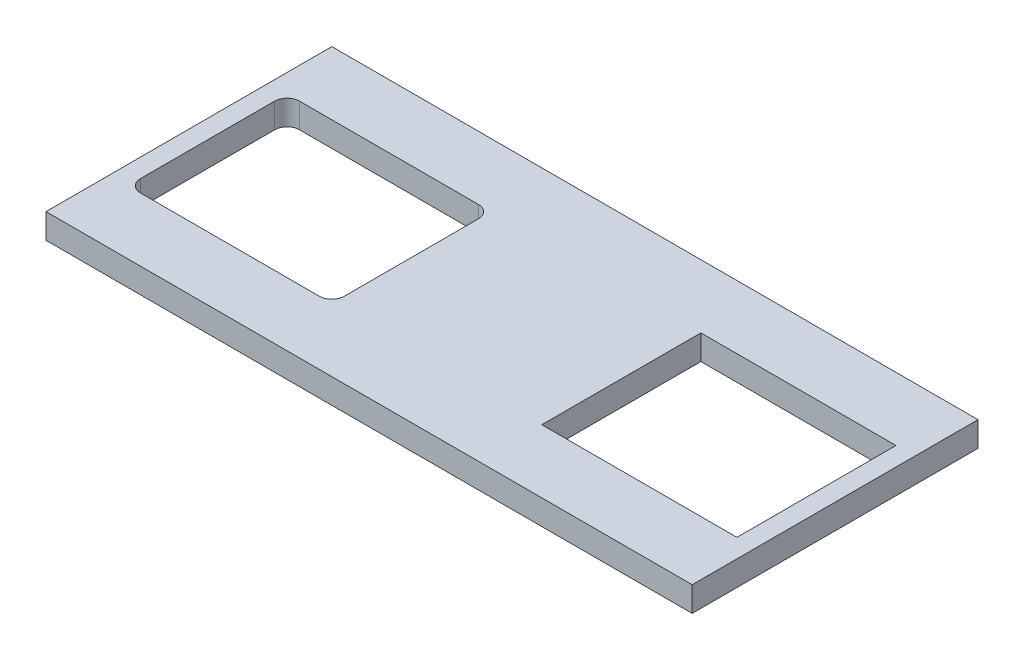
ISO-10303-21;
HEADER;
FILE_DESCRIPTION(('STEP AP214'),'2;1');
FILE_NAME('part.step','',(''),(''),'','','');
FILE_SCHEMA(('AUTOMOTIVE_DESIGN { 1 0 10303 214 1 1 1 1 }'));
ENDSEC;
DATA;
#1=APPLICATION_CONTEXT('core data for automotive mechanical design processes');
#2=APPLICATION_PROTOCOL_DEFINITION('international standard','automotive_design',2000,#1);
#3=PRODUCT_CONTEXT('',#1,'mechanical');
#4=PRODUCT('Part','Part','',(#3));
#5=PRODUCT_RELATED_PRODUCT_CATEGORY('part','',(#4));
#6=PRODUCT_DEFINITION_FORMATION('','',#4);
#7=PRODUCT_DEFINITION_CONTEXT('part definition',#1,'design');
#8=PRODUCT_DEFINITION('design','',#6,#7);
#9=PRODUCT_DEFINITION_SHAPE('','',#8);
#10=(LENGTH_UNIT() NAMED_UNIT(*) SI_UNIT(.MILLI.,.METRE.));
#11=(NAMED_UNIT(*) PLANE_ANGLE_UNIT() SI_UNIT($,.RADIAN.));
#12=(NAMED_UNIT(*) SI_UNIT($,.STERADIAN.) SOLID_ANGLE_UNIT());
#13=UNCERTAINTY_MEASURE_WITH_UNIT(LENGTH_MEASURE(1.E-05),#10,'distance_accuracy_value','');
#14=(GEOMETRIC_REPRESENTATION_CONTEXT(3) GLOBAL_UNCERTAINTY_ASSIGNED_CONTEXT((#13)) GLOBAL_UNIT_ASSIGNED_CONTEXT((#10,
#11,#12)) REPRESENTATION_CONTEXT('',''));
#15=CARTESIAN_POINT('',(0.,0.,0.));
#16=DIRECTION('',(0.,0.,1.));
#17=DIRECTION('',(1.,0.,0.));
#18=AXIS2_PLACEMENT_3D('',#15,#16,#17);
#19=CARTESIAN_POINT('',(0.,10.,-89.5000000000001));
#20=DIRECTION('',(0.,0.,-1.));
#21=DIRECTION('',(-1.,0.,0.));
#22=AXIS2_PLACEMENT_3D('',#19,#20,#21);
#23=PLANE('',#22);
#24=DIRECTION('',(1.,0.,0.));
#25=VECTOR('',#24,1.);
#26=CARTESIAN_POINT('',(0.,0.,-89.5000000000001));
#27=LINE('',#26,#25);
#28=CARTESIAN_POINT('',(-85.9931150513852,0.,-89.5000000000001));
#29=VERTEX_POINT('',#28);
#30=CARTESIAN_POINT('',(-7.50000000000001,0.,-89.5000000000001));
#31=VERTEX_POINT('',#30);
#32=EDGE_CURVE('E239',#29,#31,#27,.T.);
#33=ORIENTED_EDGE('',*,*,#32,.T.);
#34=DIRECTION('',(0.,-1.,0.));
#35=VECTOR('',#34,1.);
#36=CARTESIAN_POINT('',(-7.50000000000001,10.,-89.5000000000001));
#37=LINE('',#36,#35);
#38=CARTESIAN_POINT('',(-7.50000000000001,10.,-89.5000000000001));
#39=VERTEX_POINT('',#38);
#40=EDGE_CURVE('E11',#39,#31,#37,.T.);
#41=ORIENTED_EDGE('',*,*,#40,.F.);
#42=DIRECTION('',(1.,0.,0.));
#43=VECTOR('',#42,1.);
#44=CARTESIAN_POINT('',(0.,10.,-89.5000000000001));
#45=LINE('',#44,#43);
#46=CARTESIAN_POINT('',(-85.9931150513852,10.,-89.5000000000001));
#47=VERTEX_POINT('',#46);
#48=EDGE_CURVE('E171',#47,#39,#45,.T.);
#49=ORIENTED_EDGE('',*,*,#48,.F.);
#50=DIRECTION('',(0.,-1.,0.));
#51=VECTOR('',#50,1.);
#52=CARTESIAN_POINT('',(-85.9931150513852,10.,-89.5000000000001));
#53=LINE('',#52,#51);
#54=EDGE_CURVE('E63',#47,#29,#53,.T.);
#55=ORIENTED_EDGE('',*,*,#54,.T.);
#56=EDGE_LOOP('',(#33,#41,#49,#55));
#57=FACE_BOUND('',#56,.T.);
#58=ADVANCED_FACE('F43',(#57),#23,.F.);
#59=CARTESIAN_POINT('',(-7.5,10.,0.));
#60=DIRECTION('',(1.,0.,0.));
#61=DIRECTION('',(0.,0.,-1.));
#62=AXIS2_PLACEMENT_3D('',#59,#60,#61);
#63=PLANE('',#62);
#64=DIRECTION('',(0.,0.,1.));
#65=VECTOR('',#64,1.);
#66=CARTESIAN_POINT('',(-7.5,0.,0.));
#67=LINE('',#66,#65);
#68=CARTESIAN_POINT('',(-7.5,0.,-25.5000000000001));
#69=VERTEX_POINT('',#68);
#70=EDGE_CURVE('E178',#31,#69,#67,.T.);
#71=ORIENTED_EDGE('',*,*,#70,.T.);
#72=DIRECTION('',(0.,-1.,0.));
#73=VECTOR('',#72,1.);
#74=CARTESIAN_POINT('',(-7.5,10.,-25.5000000000001));
#75=LINE('',#74,#73);
#76=CARTESIAN_POINT('',(-7.5,10.,-25.5000000000001));
#77=VERTEX_POINT('',#76);
#78=EDGE_CURVE('E54',#77,#69,#75,.T.);
#79=ORIENTED_EDGE('',*,*,#78,.F.);
#80=DIRECTION('',(0.,0.,1.));
#81=VECTOR('',#80,1.);
#82=CARTESIAN_POINT('',(-7.5,10.,0.));
#83=LINE('',#82,#81);
#84=EDGE_CURVE('E165',#39,#77,#83,.T.);
#85=ORIENTED_EDGE('',*,*,#84,.F.);
#86=ORIENTED_EDGE('',*,*,#40,.T.);
#87=EDGE_LOOP('',(#71,#79,#85,#86));
#88=FACE_BOUND('',#87,.T.);
#89=ADVANCED_FACE('F177',(#88),#63,.F.);
#90=CARTESIAN_POINT('',(0.,10.,-25.5000000000001));
#91=DIRECTION('',(0.,0.,-1.));
#92=DIRECTION('',(-1.,0.,0.));
#93=AXIS2_PLACEMENT_3D('',#90,#91,#92);
#94=PLANE('',#93);
#95=DIRECTION('',(1.,0.,0.));
#96=VECTOR('',#95,1.);
#97=CARTESIAN_POINT('',(0.,0.,-25.5000000000001));
#98=LINE('',#97,#96);
#99=CARTESIAN_POINT('',(-85.9931150513852,0.,-25.5000000000001));
#100=VERTEX_POINT('',#99);
#101=EDGE_CURVE('E244',#100,#69,#98,.T.);
#102=ORIENTED_EDGE('',*,*,#101,.F.);
#103=DIRECTION('',(0.,-1.,0.));
#104=VECTOR('',#103,1.);
#105=CARTESIAN_POINT('',(-85.9931150513852,10.,-25.5000000000001));
#106=LINE('',#105,#104);
#107=CARTESIAN_POINT('',(-85.9931150513852,10.,-25.5000000000001));
#108=VERTEX_POINT('',#107);
#109=EDGE_CURVE('E113',#108,#100,#106,.T.);
#110=ORIENTED_EDGE('',*,*,#109,.F.);
#111=DIRECTION('',(1.,0.,0.));
#112=VECTOR('',#111,1.);
#113=CARTESIAN_POINT('',(0.,10.,-25.5000000000001));
#114=LINE('',#113,#112);
#115=EDGE_CURVE('E170',#108,#77,#114,.T.);
#116=ORIENTED_EDGE('',*,*,#115,.T.);
#117=ORIENTED_EDGE('',*,*,#78,.T.);
#118=EDGE_LOOP('',(#102,#110,#116,#117));
#119=FACE_BOUND('',#118,.T.);
#120=ADVANCED_FACE('F183',(#119),#94,.T.);
#121=CARTESIAN_POINT('',(-260.,10.,0.));
#122=DIRECTION('',(-1.,0.,0.));
#123=DIRECTION('',(0.,0.,1.));
#124=AXIS2_PLACEMENT_3D('',#121,#122,#123);
#125=PLANE('',#124);
#126=DIRECTION('',(0.,0.,-1.));
#127=VECTOR('',#126,1.);
#128=CARTESIAN_POINT('',(-260.,0.,0.));
#129=LINE('',#128,#127);
#130=CARTESIAN_POINT('',(-260.,0.,0.));
#131=VERTEX_POINT('',#130);
#132=CARTESIAN_POINT('',(-260.,0.,-115.));
#133=VERTEX_POINT('',#132);
#134=EDGE_CURVE('E223',#131,#133,#129,.T.);
#135=ORIENTED_EDGE('',*,*,#134,.F.);
#136=DIRECTION('',(0.,-1.,0.));
#137=VECTOR('',#136,1.);
#138=CARTESIAN_POINT('',(-260.,10.,0.));
#139=LINE('',#138,#137);
#140=CARTESIAN_POINT('',(-260.,10.,0.));
#141=VERTEX_POINT('',#140);
#142=EDGE_CURVE('E254',#141,#131,#139,.T.);
#143=ORIENTED_EDGE('',*,*,#142,.F.);
#144=DIRECTION('',(0.,0.,-1.));
#145=VECTOR('',#144,1.);
#146=CARTESIAN_POINT('',(-260.,10.,0.));
#147=LINE('',#146,#145);
#148=CARTESIAN_POINT('',(-260.,10.,-115.));
#149=VERTEX_POINT('',#148);
#150=EDGE_CURVE('E352',#141,#149,#147,.T.);
#151=ORIENTED_EDGE('',*,*,#150,.T.);
#152=DIRECTION('',(0.,-1.,0.));
#153=VECTOR('',#152,1.);
#154=CARTESIAN_POINT('',(-260.,10.,-115.));
#155=LINE('',#154,#153);
#156=EDGE_CURVE('E257',#149,#133,#155,.T.);
#157=ORIENTED_EDGE('',*,*,#156,.T.);
#158=EDGE_LOOP('',(#135,#143,#151,#157));
#159=FACE_BOUND('',#158,.T.);
#160=ADVANCED_FACE('F376',(#159),#125,.T.);
#161=CARTESIAN_POINT('',(0.,10.,0.));
#162=DIRECTION('',(0.,0.,1.));
#163=DIRECTION('',(1.,0.,0.));
#164=AXIS2_PLACEMENT_3D('',#161,#162,#163);
#165=PLANE('',#164);
#166=DIRECTION('',(-1.,0.,0.));
#167=VECTOR('',#166,1.);
#168=CARTESIAN_POINT('',(0.,0.,0.));
#169=LINE('',#168,#167);
#170=CARTESIAN_POINT('',(0.,0.,0.));
#171=VERTEX_POINT('',#170);
#172=EDGE_CURVE('E227',#171,#131,#169,.T.);
#173=ORIENTED_EDGE('',*,*,#172,.F.);
#174=DIRECTION('',(0.,-1.,0.));
#175=VECTOR('',#174,1.);
#176=CARTESIAN_POINT('',(0.,10.,0.));
#177=LINE('',#176,#175);
#178=CARTESIAN_POINT('',(0.,10.,0.));
#179=VERTEX_POINT('',#178);
#180=EDGE_CURVE('E264',#179,#171,#177,.T.);
#181=ORIENTED_EDGE('',*,*,#180,.F.);
#182=DIRECTION('',(-1.,0.,0.));
#183=VECTOR('',#182,1.);
#184=CARTESIAN_POINT('',(0.,10.,0.));
#185=LINE('',#184,#183);
#186=EDGE_CURVE('E356',#179,#141,#185,.T.);
#187=ORIENTED_EDGE('',*,*,#186,.T.);
#188=ORIENTED_EDGE('',*,*,#142,.T.);
#189=EDGE_LOOP('',(#173,#181,#187,#188));
#190=FACE_BOUND('',#189,.T.);
#191=ADVANCED_FACE('F379',(#190),#165,.T.);
#192=CARTESIAN_POINT('',(0.,10.,0.));
#193=DIRECTION('',(-1.,0.,0.));
#194=DIRECTION('',(0.,0.,1.));
#195=AXIS2_PLACEMENT_3D('',#192,#193,#194);
#196=PLANE('',#195);
#197=DIRECTION('',(0.,0.,-1.));
#198=VECTOR('',#197,1.);
#199=CARTESIAN_POINT('',(0.,0.,0.));
#200=LINE('',#199,#198);
#201=CARTESIAN_POINT('',(0.,0.,-115.));
#202=VERTEX_POINT('',#201);
#203=EDGE_CURVE('E231',#171,#202,#200,.T.);
#204=ORIENTED_EDGE('',*,*,#203,.T.);
#205=DIRECTION('',(0.,-1.,0.));
#206=VECTOR('',#205,1.);
#207=CARTESIAN_POINT('',(0.,10.,-115.));
#208=LINE('',#207,#206);
#209=CARTESIAN_POINT('',(0.,10.,-115.));
#210=VERTEX_POINT('',#209);
#211=EDGE_CURVE('E260',#210,#202,#208,.T.);
#212=ORIENTED_EDGE('',*,*,#211,.F.);
#213=DIRECTION('',(0.,0.,-1.));
#214=VECTOR('',#213,1.);
#215=CARTESIAN_POINT('',(0.,10.,0.));
#216=LINE('',#215,#214);
#217=EDGE_CURVE('E360',#179,#210,#216,.T.);
#218=ORIENTED_EDGE('',*,*,#217,.F.);
#219=ORIENTED_EDGE('',*,*,#180,.T.);
#220=EDGE_LOOP('',(#204,#212,#218,#219));
#221=FACE_BOUND('',#220,.T.);
#222=ADVANCED_FACE('F382',(#221),#196,.F.);
#223=CARTESIAN_POINT('',(-247.5,10.,-84.4999999999999));
#224=DIRECTION('',(0.,-1.,0.));
#225=DIRECTION('',(0.,0.,-1.));
#226=AXIS2_PLACEMENT_3D('',#223,#224,#225);
#227=CYLINDRICAL_SURFACE('',#226,5.);
#228=CARTESIAN_POINT('',(-247.5,0.,-84.4999999999999));
#229=DIRECTION('',(0.,1.,0.));
#230=DIRECTION('',(0.,0.,1.));
#231=AXIS2_PLACEMENT_3D('',#228,#229,#230);
#232=CIRCLE('',#231,5.);
#233=CARTESIAN_POINT('',(-247.5,0.,-89.4999999999999));
#234=VERTEX_POINT('',#233);
#235=CARTESIAN_POINT('',(-252.5,0.,-84.4999999999999));
#236=VERTEX_POINT('',#235);
#237=EDGE_CURVE('E192',#234,#236,#232,.T.);
#238=ORIENTED_EDGE('',*,*,#237,.F.);
#239=DIRECTION('',(0.,-1.,0.));
#240=VECTOR('',#239,1.);
#241=CARTESIAN_POINT('',(-247.5,10.,-89.4999999999999));
#242=LINE('',#241,#240);
#243=CARTESIAN_POINT('',(-247.5,10.,-89.4999999999999));
#244=VERTEX_POINT('',#243);
#245=EDGE_CURVE('E47',#244,#234,#242,.T.);
#246=ORIENTED_EDGE('',*,*,#245,.F.);
#247=CARTESIAN_POINT('',(-247.5,10.,-84.4999999999999));
#248=DIRECTION('',(0.,1.,0.));
#249=DIRECTION('',(0.,0.,1.));
#250=AXIS2_PLACEMENT_3D('',#247,#248,#249);
#251=CIRCLE('',#250,5.);
#252=CARTESIAN_POINT('',(-252.5,10.,-84.4999999999999));
#253=VERTEX_POINT('',#252);
#254=EDGE_CURVE('E251',#244,#253,#251,.T.);
#255=ORIENTED_EDGE('',*,*,#254,.T.);
#256=DIRECTION('',(0.,-1.,0.));
#257=VECTOR('',#256,1.);
#258=CARTESIAN_POINT('',(-252.5,10.,-84.4999999999999));
#259=LINE('',#258,#257);
#260=EDGE_CURVE('E188',#253,#236,#259,.T.);
#261=ORIENTED_EDGE('',*,*,#260,.T.);
#262=EDGE_LOOP('',(#238,#246,#255,#261));
#263=FACE_BOUND('',#262,.T.);
#264=ADVANCED_FACE('F45',(#263),#227,.F.);
#265=CARTESIAN_POINT('',(0.,10.,-89.5000000000001));
#266=DIRECTION('',(0.,0.,-1.));
#267=DIRECTION('',(-1.,0.,0.));
#268=AXIS2_PLACEMENT_3D('',#265,#266,#267);
#269=PLANE('',#268);
#270=DIRECTION('',(1.,0.,0.));
#271=VECTOR('',#270,1.);
#272=CARTESIAN_POINT('',(0.,0.,-89.5000000000001));
#273=LINE('',#272,#271);
#274=CARTESIAN_POINT('',(-175.5,0.,-89.5));
#275=VERTEX_POINT('',#274);
#276=EDGE_CURVE('E196',#234,#275,#273,.T.);
#277=ORIENTED_EDGE('',*,*,#276,.T.);
#278=DIRECTION('',(0.,-1.,0.));
#279=VECTOR('',#278,1.);
#280=CARTESIAN_POINT('',(-175.5,10.,-89.5));
#281=LINE('',#280,#279);
#282=CARTESIAN_POINT('',(-175.5,10.,-89.5));
#283=VERTEX_POINT('',#282);
#284=EDGE_CURVE('E286',#283,#275,#281,.T.);
#285=ORIENTED_EDGE('',*,*,#284,.F.);
#286=DIRECTION('',(1.,0.,0.));
#287=VECTOR('',#286,1.);
#288=CARTESIAN_POINT('',(0.,10.,-89.5000000000001));
#289=LINE('',#288,#287);
#290=EDGE_CURVE('E296',#244,#283,#289,.T.);
#291=ORIENTED_EDGE('',*,*,#290,.F.);
#292=ORIENTED_EDGE('',*,*,#245,.T.);
#293=EDGE_LOOP('',(#277,#285,#291,#292));
#294=FACE_BOUND('',#293,.T.);
#295=ADVANCED_FACE('F295',(#294),#269,.F.);
#296=CARTESIAN_POINT('',(-175.5,10.,-84.5));
#297=DIRECTION('',(0.,-1.,0.));
#298=DIRECTION('',(0.,0.,-1.));
#299=AXIS2_PLACEMENT_3D('',#296,#297,#298);
#300=CYLINDRICAL_SURFACE('',#299,5.);
#301=CARTESIAN_POINT('',(-175.5,0.,-84.5));
#302=DIRECTION('',(0.,1.,0.));
#303=DIRECTION('',(0.,0.,1.));
#304=AXIS2_PLACEMENT_3D('',#301,#302,#303);
#305=CIRCLE('',#304,5.);
#306=CARTESIAN_POINT('',(-170.5,0.,-84.4999999999999));
#307=VERTEX_POINT('',#306);
#308=EDGE_CURVE('E200',#307,#275,#305,.T.);
#309=ORIENTED_EDGE('',*,*,#308,.F.);
#310=DIRECTION('',(0.,-1.,0.));
#311=VECTOR('',#310,1.);
#312=CARTESIAN_POINT('',(-170.5,10.,-84.4999999999999));
#313=LINE('',#312,#311);
#314=CARTESIAN_POINT('',(-170.5,10.,-84.4999999999999));
#315=VERTEX_POINT('',#314);
#316=EDGE_CURVE('E284',#315,#307,#313,.T.);
#317=ORIENTED_EDGE('',*,*,#316,.F.);
#318=CARTESIAN_POINT('',(-175.5,10.,-84.5));
#319=DIRECTION('',(0.,1.,0.));
#320=DIRECTION('',(0.,0.,1.));
#321=AXIS2_PLACEMENT_3D('',#318,#319,#320);
#322=CIRCLE('',#321,5.);
#323=EDGE_CURVE('E330',#315,#283,#322,.T.);
#324=ORIENTED_EDGE('',*,*,#323,.T.);
#325=ORIENTED_EDGE('',*,*,#284,.T.);
#326=EDGE_LOOP('',(#309,#317,#324,#325));
#327=FACE_BOUND('',#326,.T.);
#328=ADVANCED_FACE('F327',(#327),#300,.F.);
#329=CARTESIAN_POINT('',(-170.5,10.,0.));
#330=DIRECTION('',(1.,0.,0.));
#331=DIRECTION('',(0.,0.,-1.));
#332=AXIS2_PLACEMENT_3D('',#329,#330,#331);
#333=PLANE('',#332);
#334=DIRECTION('',(0.,0.,1.));
#335=VECTOR('',#334,1.);
#336=CARTESIAN_POINT('',(-170.5,0.,0.));
#337=LINE('',#336,#335);
#338=CARTESIAN_POINT('',(-170.5,0.,-30.5));
#339=VERTEX_POINT('',#338);
#340=EDGE_CURVE('E204',#307,#339,#337,.T.);
#341=ORIENTED_EDGE('',*,*,#340,.T.);
#342=DIRECTION('',(0.,-1.,0.));
#343=VECTOR('',#342,1.);
#344=CARTESIAN_POINT('',(-170.5,10.,-30.5));
#345=LINE('',#344,#343);
#346=CARTESIAN_POINT('',(-170.5,10.,-30.5));
#347=VERTEX_POINT('',#346);
#348=EDGE_CURVE('E280',#347,#339,#345,.T.);
#349=ORIENTED_EDGE('',*,*,#348,.F.);
#350=DIRECTION('',(0.,0.,1.));
#351=VECTOR('',#350,1.);
#352=CARTESIAN_POINT('',(-170.5,10.,0.));
#353=LINE('',#352,#351);
#354=EDGE_CURVE('E331',#315,#347,#353,.T.);
#355=ORIENTED_EDGE('',*,*,#354,.F.);
#356=ORIENTED_EDGE('',*,*,#316,.T.);
#357=EDGE_LOOP('',(#341,#349,#355,#356));
#358=FACE_BOUND('',#357,.T.);
#359=ADVANCED_FACE('F332',(#358),#333,.F.);
#360=CARTESIAN_POINT('',(-175.5,10.,-30.5));
#361=DIRECTION('',(0.,-1.,0.));
#362=DIRECTION('',(0.,0.,-1.));
#363=AXIS2_PLACEMENT_3D('',#360,#361,#362);
#364=CYLINDRICAL_SURFACE('',#363,5.);
#365=CARTESIAN_POINT('',(-175.5,0.,-30.5));
#366=DIRECTION('',(0.,1.,0.));
#367=DIRECTION('',(0.,0.,1.));
#368=AXIS2_PLACEMENT_3D('',#365,#366,#367);
#369=CIRCLE('',#368,5.);
#370=CARTESIAN_POINT('',(-175.5,0.,-25.5));
#371=VERTEX_POINT('',#370);
#372=EDGE_CURVE('E207',#339,#371,#369,.F.);
#373=ORIENTED_EDGE('',*,*,#372,.T.);
#374=DIRECTION('',(0.,-1.,0.));
#375=VECTOR('',#374,1.);
#376=CARTESIAN_POINT('',(-175.5,10.,-25.5));
#377=LINE('',#376,#375);
#378=CARTESIAN_POINT('',(-175.5,10.,-25.5));
#379=VERTEX_POINT('',#378);
#380=EDGE_CURVE('E277',#379,#371,#377,.T.);
#381=ORIENTED_EDGE('',*,*,#380,.F.);
#382=CARTESIAN_POINT('',(-175.5,10.,-30.5));
#383=DIRECTION('',(0.,1.,0.));
#384=DIRECTION('',(0.,0.,1.));
#385=AXIS2_PLACEMENT_3D('',#382,#383,#384);
#386=CIRCLE('',#385,5.);
#387=EDGE_CURVE('E335',#347,#379,#386,.F.);
#388=ORIENTED_EDGE('',*,*,#387,.F.);
#389=ORIENTED_EDGE('',*,*,#348,.T.);
#390=EDGE_LOOP('',(#373,#381,#388,#389));
#391=FACE_BOUND('',#390,.T.);
#392=ADVANCED_FACE('F324',(#391),#364,.F.);
#393=CARTESIAN_POINT('',(0.,10.,-25.4999999999999));
#394=DIRECTION('',(0.,0.,-1.));
#395=DIRECTION('',(-1.,0.,0.));
#396=AXIS2_PLACEMENT_3D('',#393,#394,#395);
#397=PLANE('',#396);
#398=DIRECTION('',(1.,0.,0.));
#399=VECTOR('',#398,1.);
#400=CARTESIAN_POINT('',(0.,0.,-25.4999999999999));
#401=LINE('',#400,#399);
#402=CARTESIAN_POINT('',(-247.5,0.,-25.5));
#403=VERTEX_POINT('',#402);
#404=EDGE_CURVE('E211',#403,#371,#401,.T.);
#405=ORIENTED_EDGE('',*,*,#404,.F.);
#406=DIRECTION('',(0.,-1.,0.));
#407=VECTOR('',#406,1.);
#408=CARTESIAN_POINT('',(-247.5,10.,-25.5));
#409=LINE('',#408,#407);
#410=CARTESIAN_POINT('',(-247.5,10.,-25.5));
#411=VERTEX_POINT('',#410);
#412=EDGE_CURVE('E274',#411,#403,#409,.T.);
#413=ORIENTED_EDGE('',*,*,#412,.F.);
#414=DIRECTION('',(1.,0.,0.));
#415=VECTOR('',#414,1.);
#416=CARTESIAN_POINT('',(0.,10.,-25.4999999999999));
#417=LINE('',#416,#415);
#418=EDGE_CURVE('E321',#411,#379,#417,.T.);
#419=ORIENTED_EDGE('',*,*,#418,.T.);
#420=ORIENTED_EDGE('',*,*,#380,.T.);
#421=EDGE_LOOP('',(#405,#413,#419,#420));
#422=FACE_BOUND('',#421,.T.);
#423=ADVANCED_FACE('F319',(#422),#397,.T.);
#424=CARTESIAN_POINT('',(-247.5,10.,-30.5));
#425=DIRECTION('',(0.,-1.,0.));
#426=DIRECTION('',(0.,0.,-1.));
#427=AXIS2_PLACEMENT_3D('',#424,#425,#426);
#428=CYLINDRICAL_SURFACE('',#427,5.);
#429=CARTESIAN_POINT('',(-247.5,0.,-30.5));
#430=DIRECTION('',(0.,1.,0.));
#431=DIRECTION('',(0.,0.,1.));
#432=AXIS2_PLACEMENT_3D('',#429,#430,#431);
#433=CIRCLE('',#432,5.);
#434=CARTESIAN_POINT('',(-252.5,0.,-30.5));
#435=VERTEX_POINT('',#434);
#436=EDGE_CURVE('E215',#435,#403,#433,.T.);
#437=ORIENTED_EDGE('',*,*,#436,.F.);
#438=DIRECTION('',(0.,-1.,0.));
#439=VECTOR('',#438,1.);
#440=CARTESIAN_POINT('',(-252.5,10.,-30.5));
#441=LINE('',#440,#439);
#442=CARTESIAN_POINT('',(-252.5,10.,-30.5));
#443=VERTEX_POINT('',#442);
#444=EDGE_CURVE('E271',#443,#435,#441,.T.);
#445=ORIENTED_EDGE('',*,*,#444,.F.);
#446=CARTESIAN_POINT('',(-247.5,10.,-30.5));
#447=DIRECTION('',(0.,1.,0.));
#448=DIRECTION('',(0.,0.,1.));
#449=AXIS2_PLACEMENT_3D('',#446,#447,#448);
#450=CIRCLE('',#449,5.);
#451=EDGE_CURVE('E315',#443,#411,#450,.T.);
#452=ORIENTED_EDGE('',*,*,#451,.T.);
#453=ORIENTED_EDGE('',*,*,#412,.T.);
#454=EDGE_LOOP('',(#437,#445,#452,#453));
#455=FACE_BOUND('',#454,.T.);
#456=ADVANCED_FACE('F312',(#455),#428,.F.);
#457=CARTESIAN_POINT('',(0.,10.,-115.));
#458=DIRECTION('',(0.,0.,1.));
#459=DIRECTION('',(1.,0.,0.));
#460=AXIS2_PLACEMENT_3D('',#457,#458,#459);
#461=PLANE('',#460);
#462=DIRECTION('',(-1.,0.,0.));
#463=VECTOR('',#462,1.);
#464=CARTESIAN_POINT('',(0.,0.,-115.));
#465=LINE('',#464,#463);
#466=EDGE_CURVE('E235',#202,#133,#465,.T.);
#467=ORIENTED_EDGE('',*,*,#466,.T.);
#468=ORIENTED_EDGE('',*,*,#156,.F.);
#469=DIRECTION('',(-1.,0.,0.));
#470=VECTOR('',#469,1.);
#471=CARTESIAN_POINT('',(0.,10.,-115.));
#472=LINE('',#471,#470);
#473=EDGE_CURVE('E364',#210,#149,#472,.T.);
#474=ORIENTED_EDGE('',*,*,#473,.F.);
#475=ORIENTED_EDGE('',*,*,#211,.T.);
#476=EDGE_LOOP('',(#467,#468,#474,#475));
#477=FACE_BOUND('',#476,.T.);
#478=ADVANCED_FACE('F373',(#477),#461,.F.);
#479=CARTESIAN_POINT('',(-252.5,10.,0.));
#480=DIRECTION('',(1.,0.,0.));
#481=DIRECTION('',(0.,0.,-1.));
#482=AXIS2_PLACEMENT_3D('',#479,#480,#481);
#483=PLANE('',#482);
#484=DIRECTION('',(0.,0.,1.));
#485=VECTOR('',#484,1.);
#486=CARTESIAN_POINT('',(-252.5,0.,0.));
#487=LINE('',#486,#485);
#488=EDGE_CURVE('E219',#236,#435,#487,.T.);
#489=ORIENTED_EDGE('',*,*,#488,.F.);
#490=ORIENTED_EDGE('',*,*,#260,.F.);
#491=DIRECTION('',(0.,0.,1.));
#492=VECTOR('',#491,1.);
#493=CARTESIAN_POINT('',(-252.5,10.,0.));
#494=LINE('',#493,#492);
#495=EDGE_CURVE('E307',#253,#443,#494,.T.);
#496=ORIENTED_EDGE('',*,*,#495,.T.);
#497=ORIENTED_EDGE('',*,*,#444,.T.);
#498=EDGE_LOOP('',(#489,#490,#496,#497));
#499=FACE_BOUND('',#498,.T.);
#500=ADVANCED_FACE('F306',(#499),#483,.T.);
#501=CARTESIAN_POINT('',(-85.9931150513852,10.,0.));
#502=DIRECTION('',(1.,0.,0.));
#503=DIRECTION('',(0.,0.,-1.));
#504=AXIS2_PLACEMENT_3D('',#501,#502,#503);
#505=PLANE('',#504);
#506=DIRECTION('',(0.,0.,1.));
#507=VECTOR('',#506,1.);
#508=CARTESIAN_POINT('',(-85.9931150513852,0.,0.));
#509=LINE('',#508,#507);
#510=EDGE_CURVE('E247',#29,#100,#509,.T.);
#511=ORIENTED_EDGE('',*,*,#510,.F.);
#512=ORIENTED_EDGE('',*,*,#54,.F.);
#513=DIRECTION('',(0.,0.,1.));
#514=VECTOR('',#513,1.);
#515=CARTESIAN_POINT('',(-85.9931150513852,10.,0.));
#516=LINE('',#515,#514);
#517=EDGE_CURVE('E185',#47,#108,#516,.T.);
#518=ORIENTED_EDGE('',*,*,#517,.T.);
#519=ORIENTED_EDGE('',*,*,#109,.T.);
#520=EDGE_LOOP('',(#511,#512,#518,#519));
#521=FACE_BOUND('',#520,.T.);
#522=ADVANCED_FACE('F386',(#521),#505,.T.);
#523=CARTESIAN_POINT('',(0.,10.,0.));
#524=DIRECTION('',(0.,1.,0.));
#525=DIRECTION('',(0.,0.,1.));
#526=AXIS2_PLACEMENT_3D('',#523,#524,#525);
#527=PLANE('',#526);
#528=ORIENTED_EDGE('',*,*,#254,.F.);
#529=ORIENTED_EDGE('',*,*,#290,.T.);
#530=ORIENTED_EDGE('',*,*,#323,.F.);
#531=ORIENTED_EDGE('',*,*,#354,.T.);
#532=ORIENTED_EDGE('',*,*,#387,.T.);
#533=ORIENTED_EDGE('',*,*,#418,.F.);
#534=ORIENTED_EDGE('',*,*,#451,.F.);
#535=ORIENTED_EDGE('',*,*,#495,.F.);
#536=EDGE_LOOP('',(#528,#529,#530,#531,#532,#533,#534,#535));
#537=FACE_BOUND('',#536,.T.);
#538=ORIENTED_EDGE('',*,*,#150,.F.);
#539=ORIENTED_EDGE('',*,*,#186,.F.);
#540=ORIENTED_EDGE('',*,*,#217,.T.);
#541=ORIENTED_EDGE('',*,*,#473,.T.);
#542=EDGE_LOOP('',(#538,#539,#540,#541));
#543=FACE_BOUND('',#542,.T.);
#544=ORIENTED_EDGE('',*,*,#48,.T.);
#545=ORIENTED_EDGE('',*,*,#84,.T.);
#546=ORIENTED_EDGE('',*,*,#115,.F.);
#547=ORIENTED_EDGE('',*,*,#517,.F.);
#548=EDGE_LOOP('',(#544,#545,#546,#547));
#549=FACE_BOUND('',#548,.T.);
#550=ADVANCED_FACE('F167',(#537,#543,#549),#527,.T.);
#551=CARTESIAN_POINT('',(0.,0.,0.));
#552=DIRECTION('',(0.,1.,0.));
#553=DIRECTION('',(0.,0.,1.));
#554=AXIS2_PLACEMENT_3D('',#551,#552,#553);
#555=PLANE('',#554);
#556=ORIENTED_EDGE('',*,*,#237,.T.);
#557=ORIENTED_EDGE('',*,*,#488,.T.);
#558=ORIENTED_EDGE('',*,*,#436,.T.);
#559=ORIENTED_EDGE('',*,*,#404,.T.);
#560=ORIENTED_EDGE('',*,*,#372,.F.);
#561=ORIENTED_EDGE('',*,*,#340,.F.);
#562=ORIENTED_EDGE('',*,*,#308,.T.);
#563=ORIENTED_EDGE('',*,*,#276,.F.);
#564=EDGE_LOOP('',(#556,#557,#558,#559,#560,#561,#562,#563));
#565=FACE_BOUND('',#564,.T.);
#566=ORIENTED_EDGE('',*,*,#134,.T.);
#567=ORIENTED_EDGE('',*,*,#466,.F.);
#568=ORIENTED_EDGE('',*,*,#203,.F.);
#569=ORIENTED_EDGE('',*,*,#172,.T.);
#570=EDGE_LOOP('',(#566,#567,#568,#569));
#571=FACE_BOUND('',#570,.T.);
#572=ORIENTED_EDGE('',*,*,#32,.F.);
#573=ORIENTED_EDGE('',*,*,#510,.T.);
#574=ORIENTED_EDGE('',*,*,#101,.T.);
#575=ORIENTED_EDGE('',*,*,#70,.F.);
#576=EDGE_LOOP('',(#572,#573,#574,#575));
#577=FACE_BOUND('',#576,.T.);
#578=ADVANCED_FACE('F299',(#565,#571,#577),#555,.F.);
#579=CLOSED_SHELL('',(#58,#89,#120,#160,#191,#222,#264,#295,#328,#359,#392,#423,#456,#478,#500,
#522,#550,#578));
#580=MANIFOLD_SOLID_BREP('B2',#579);
#581=ADVANCED_BREP_SHAPE_REPRESENTATION('',(#18,#580),#14);
#582=SHAPE_DEFINITION_REPRESENTATION(#9,#581);
ENDSEC;
END-ISO-10303-21;
